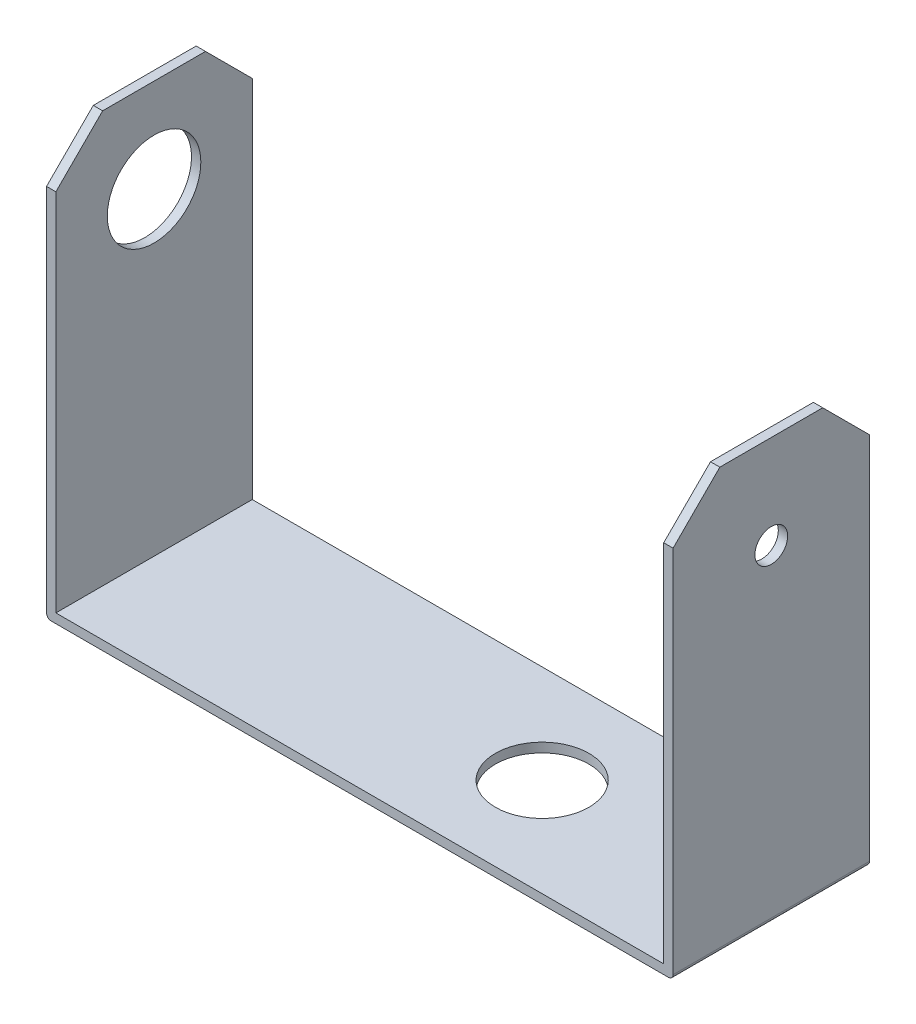
ISO-10303-21;
HEADER;
FILE_DESCRIPTION(('STEP AP214'),'2;1');
FILE_NAME('part.step','',(''),(''),'','','');
FILE_SCHEMA(('AUTOMOTIVE_DESIGN { 1 0 10303 214 1 1 1 1 }'));
ENDSEC;
DATA;
#1=APPLICATION_CONTEXT('core data for automotive mechanical design processes');
#2=APPLICATION_PROTOCOL_DEFINITION('international standard','automotive_design',2000,#1);
#3=PRODUCT_CONTEXT('',#1,'mechanical');
#4=PRODUCT('Part','Part','',(#3));
#5=PRODUCT_RELATED_PRODUCT_CATEGORY('part','',(#4));
#6=PRODUCT_DEFINITION_FORMATION('','',#4);
#7=PRODUCT_DEFINITION_CONTEXT('part definition',#1,'design');
#8=PRODUCT_DEFINITION('design','',#6,#7);
#9=PRODUCT_DEFINITION_SHAPE('','',#8);
#10=(LENGTH_UNIT() NAMED_UNIT(*) SI_UNIT(.MILLI.,.METRE.));
#11=(NAMED_UNIT(*) PLANE_ANGLE_UNIT() SI_UNIT($,.RADIAN.));
#12=(NAMED_UNIT(*) SI_UNIT($,.STERADIAN.) SOLID_ANGLE_UNIT());
#13=UNCERTAINTY_MEASURE_WITH_UNIT(LENGTH_MEASURE(1.E-05),#10,'distance_accuracy_value','');
#14=(GEOMETRIC_REPRESENTATION_CONTEXT(3) GLOBAL_UNCERTAINTY_ASSIGNED_CONTEXT((#13)) GLOBAL_UNIT_ASSIGNED_CONTEXT((#10,
#11,#12)) REPRESENTATION_CONTEXT('',''));
#15=CARTESIAN_POINT('',(0.,0.,0.));
#16=DIRECTION('',(0.,0.,1.));
#17=DIRECTION('',(1.,0.,0.));
#18=AXIS2_PLACEMENT_3D('',#15,#16,#17);
#19=CARTESIAN_POINT('',(0.,45.,-21.));
#20=DIRECTION('',(-1.,0.,0.));
#21=DIRECTION('',(0.,0.,1.));
#22=AXIS2_PLACEMENT_3D('',#19,#20,#21);
#23=PLANE('',#22);
#24=DIRECTION('',(0.,-1.,0.));
#25=VECTOR('',#24,1.);
#26=CARTESIAN_POINT('',(0.,45.,-21.));
#27=LINE('',#26,#25);
#28=CARTESIAN_POINT('',(0.,40.,-21.));
#29=VERTEX_POINT('',#28);
#30=CARTESIAN_POINT('',(0.,0.500000000000014,-21.));
#31=VERTEX_POINT('',#30);
#32=EDGE_CURVE('E193',#29,#31,#27,.T.);
#33=ORIENTED_EDGE('',*,*,#32,.F.);
#34=DIRECTION('',(0.,-0.707106781186547,-0.707106781186548));
#35=VECTOR('',#34,1.);
#36=CARTESIAN_POINT('',(0.,45.,-16.));
#37=LINE('',#36,#35);
#38=CARTESIAN_POINT('',(0.,45.,-16.));
#39=VERTEX_POINT('',#38);
#40=EDGE_CURVE('E11',#29,#39,#37,.F.);
#41=ORIENTED_EDGE('',*,*,#40,.T.);
#42=DIRECTION('',(0.,0.,-1.));
#43=VECTOR('',#42,1.);
#44=CARTESIAN_POINT('',(0.,45.,-21.));
#45=LINE('',#44,#43);
#46=CARTESIAN_POINT('',(0.,45.,-5.00000000000003));
#47=VERTEX_POINT('',#46);
#48=EDGE_CURVE('E177',#47,#39,#45,.T.);
#49=ORIENTED_EDGE('',*,*,#48,.F.);
#50=DIRECTION('',(0.,0.707106781186547,-0.707106781186548));
#51=VECTOR('',#50,1.);
#52=CARTESIAN_POINT('',(0.,45.,-5.00000000000003));
#53=LINE('',#52,#51);
#54=CARTESIAN_POINT('',(0.,40.,0.));
#55=VERTEX_POINT('',#54);
#56=EDGE_CURVE('E42',#47,#55,#53,.F.);
#57=ORIENTED_EDGE('',*,*,#56,.T.);
#58=DIRECTION('',(0.,-1.,0.));
#59=VECTOR('',#58,1.);
#60=CARTESIAN_POINT('',(0.,45.,0.));
#61=LINE('',#60,#59);
#62=CARTESIAN_POINT('',(0.,0.500000000000014,0.));
#63=VERTEX_POINT('',#62);
#64=EDGE_CURVE('E183',#55,#63,#61,.T.);
#65=ORIENTED_EDGE('',*,*,#64,.T.);
#66=DIRECTION('',(0.,0.,-1.));
#67=VECTOR('',#66,1.);
#68=CARTESIAN_POINT('',(0.,0.5,-21.));
#69=LINE('',#68,#67);
#70=EDGE_CURVE('E195',#63,#31,#69,.T.);
#71=ORIENTED_EDGE('',*,*,#70,.T.);
#72=EDGE_LOOP('',(#33,#41,#49,#57,#65,#71));
#73=FACE_BOUND('',#72,.T.);
#74=CARTESIAN_POINT('',(0.,35.,-10.5));
#75=DIRECTION('',(1.,0.,0.));
#76=DIRECTION('',(0.,0.,-1.));
#77=AXIS2_PLACEMENT_3D('',#74,#75,#76);
#78=CIRCLE('',#77,1.75);
#79=CARTESIAN_POINT('',(0.,35.,-12.25));
#80=VERTEX_POINT('',#79);
#81=EDGE_CURVE('E366',#80,#80,#78,.T.);
#82=ORIENTED_EDGE('',*,*,#81,.F.);
#83=EDGE_LOOP('',(#82));
#84=FACE_BOUND('',#83,.T.);
#85=ADVANCED_FACE('F34',(#73,#84),#23,.F.);
#86=CARTESIAN_POINT('',(0.,45.,0.));
#87=DIRECTION('',(0.,-1.,0.));
#88=DIRECTION('',(0.,0.,-1.));
#89=AXIS2_PLACEMENT_3D('',#86,#87,#88);
#90=PLANE('',#89);
#91=ORIENTED_EDGE('',*,*,#48,.T.);
#92=DIRECTION('',(-1.,0.,0.));
#93=VECTOR('',#92,1.);
#94=CARTESIAN_POINT('',(0.,45.,-16.));
#95=LINE('',#94,#93);
#96=CARTESIAN_POINT('',(-1.,45.,-16.));
#97=VERTEX_POINT('',#96);
#98=EDGE_CURVE('E239',#39,#97,#95,.T.);
#99=ORIENTED_EDGE('',*,*,#98,.T.);
#100=DIRECTION('',(0.,0.,-1.));
#101=VECTOR('',#100,1.);
#102=CARTESIAN_POINT('',(-1.,45.,0.));
#103=LINE('',#102,#101);
#104=CARTESIAN_POINT('',(-1.,45.,-5.00000000000003));
#105=VERTEX_POINT('',#104);
#106=EDGE_CURVE('E172',#105,#97,#103,.T.);
#107=ORIENTED_EDGE('',*,*,#106,.F.);
#108=DIRECTION('',(1.,0.,0.));
#109=VECTOR('',#108,1.);
#110=CARTESIAN_POINT('',(0.,45.,-5.00000000000003));
#111=LINE('',#110,#109);
#112=EDGE_CURVE('E237',#105,#47,#111,.T.);
#113=ORIENTED_EDGE('',*,*,#112,.T.);
#114=EDGE_LOOP('',(#91,#99,#107,#113));
#115=FACE_BOUND('',#114,.T.);
#116=ADVANCED_FACE('F254',(#115),#90,.F.);
#117=DIRECTION('',(0.,0.,1.));
#118=VECTOR('',#117,1.);
#119=CARTESIAN_POINT('',(-66.,45.,0.));
#120=LINE('',#119,#118);
#121=CARTESIAN_POINT('',(-66.,45.,-16.));
#122=VERTEX_POINT('',#121);
#123=CARTESIAN_POINT('',(-66.,45.,-5.00000000000003));
#124=VERTEX_POINT('',#123);
#125=EDGE_CURVE('E168',#122,#124,#120,.T.);
#126=ORIENTED_EDGE('',*,*,#125,.F.);
#127=DIRECTION('',(-1.,0.,0.));
#128=VECTOR('',#127,1.);
#129=CARTESIAN_POINT('',(0.,45.,-16.));
#130=LINE('',#129,#128);
#131=CARTESIAN_POINT('',(-67.,45.,-16.));
#132=VERTEX_POINT('',#131);
#133=EDGE_CURVE('E218',#122,#132,#130,.T.);
#134=ORIENTED_EDGE('',*,*,#133,.T.);
#135=DIRECTION('',(0.,0.,1.));
#136=VECTOR('',#135,1.);
#137=CARTESIAN_POINT('',(-67.,45.,0.));
#138=LINE('',#137,#136);
#139=CARTESIAN_POINT('',(-67.,45.,-5.00000000000003));
#140=VERTEX_POINT('',#139);
#141=EDGE_CURVE('E179',#132,#140,#138,.T.);
#142=ORIENTED_EDGE('',*,*,#141,.T.);
#143=DIRECTION('',(1.,0.,0.));
#144=VECTOR('',#143,1.);
#145=CARTESIAN_POINT('',(0.,45.,-5.00000000000003));
#146=LINE('',#145,#144);
#147=EDGE_CURVE('E215',#140,#124,#146,.T.);
#148=ORIENTED_EDGE('',*,*,#147,.T.);
#149=EDGE_LOOP('',(#126,#134,#142,#148));
#150=FACE_BOUND('',#149,.T.);
#151=ADVANCED_FACE('F282',(#150),#90,.F.);
#152=CARTESIAN_POINT('',(-67.,45.,-21.));
#153=DIRECTION('',(0.,0.,1.));
#154=DIRECTION('',(1.,0.,0.));
#155=AXIS2_PLACEMENT_3D('',#152,#153,#154);
#156=PLANE('',#155);
#157=DIRECTION('',(0.,-1.,0.));
#158=VECTOR('',#157,1.);
#159=CARTESIAN_POINT('',(-67.,45.,-21.));
#160=LINE('',#159,#158);
#161=CARTESIAN_POINT('',(-67.,40.,-21.));
#162=VERTEX_POINT('',#161);
#163=CARTESIAN_POINT('',(-67.,0.500000000000014,-21.));
#164=VERTEX_POINT('',#163);
#165=EDGE_CURVE('E191',#162,#164,#160,.T.);
#166=ORIENTED_EDGE('',*,*,#165,.F.);
#167=DIRECTION('',(1.,0.,0.));
#168=VECTOR('',#167,1.);
#169=CARTESIAN_POINT('',(-67.,40.,-21.));
#170=LINE('',#169,#168);
#171=CARTESIAN_POINT('',(-66.,40.,-21.));
#172=VERTEX_POINT('',#171);
#173=EDGE_CURVE('E227',#162,#172,#170,.T.);
#174=ORIENTED_EDGE('',*,*,#173,.T.);
#175=DIRECTION('',(0.,-1.,0.));
#176=VECTOR('',#175,1.);
#177=CARTESIAN_POINT('',(-66.,45.,-21.));
#178=LINE('',#177,#176);
#179=CARTESIAN_POINT('',(-66.,1.,-21.));
#180=VERTEX_POINT('',#179);
#181=EDGE_CURVE('E146',#172,#180,#178,.T.);
#182=ORIENTED_EDGE('',*,*,#181,.T.);
#183=DIRECTION('',(-1.,0.,0.));
#184=VECTOR('',#183,1.);
#185=CARTESIAN_POINT('',(0.,1.,-21.));
#186=LINE('',#185,#184);
#187=CARTESIAN_POINT('',(-1.,1.,-21.));
#188=VERTEX_POINT('',#187);
#189=EDGE_CURVE('E153',#188,#180,#186,.T.);
#190=ORIENTED_EDGE('',*,*,#189,.F.);
#191=DIRECTION('',(0.,-1.,0.));
#192=VECTOR('',#191,1.);
#193=CARTESIAN_POINT('',(-1.00000000000001,45.,-21.));
#194=LINE('',#193,#192);
#195=CARTESIAN_POINT('',(-1.00000000000001,40.,-21.));
#196=VERTEX_POINT('',#195);
#197=EDGE_CURVE('E135',#196,#188,#194,.T.);
#198=ORIENTED_EDGE('',*,*,#197,.F.);
#199=DIRECTION('',(1.,0.,0.));
#200=VECTOR('',#199,1.);
#201=CARTESIAN_POINT('',(-67.,40.,-21.));
#202=LINE('',#201,#200);
#203=EDGE_CURVE('E225',#196,#29,#202,.T.);
#204=ORIENTED_EDGE('',*,*,#203,.T.);
#205=ORIENTED_EDGE('',*,*,#32,.T.);
#206=CARTESIAN_POINT('',(-0.5,0.5,-21.));
#207=DIRECTION('',(0.,0.,1.));
#208=DIRECTION('',(1.,0.,0.));
#209=AXIS2_PLACEMENT_3D('',#206,#207,#208);
#210=CIRCLE('',#209,0.5);
#211=CARTESIAN_POINT('',(-0.5,0.,-21.));
#212=VERTEX_POINT('',#211);
#213=EDGE_CURVE('E201',#31,#212,#210,.F.);
#214=ORIENTED_EDGE('',*,*,#213,.T.);
#215=DIRECTION('',(-1.,0.,0.));
#216=VECTOR('',#215,1.);
#217=CARTESIAN_POINT('',(-67.,0.,-21.));
#218=LINE('',#217,#216);
#219=CARTESIAN_POINT('',(-66.5,0.,-21.));
#220=VERTEX_POINT('',#219);
#221=EDGE_CURVE('E145',#212,#220,#218,.T.);
#222=ORIENTED_EDGE('',*,*,#221,.T.);
#223=CARTESIAN_POINT('',(-66.5,0.5,-21.));
#224=DIRECTION('',(0.,0.,1.));
#225=DIRECTION('',(1.,0.,0.));
#226=AXIS2_PLACEMENT_3D('',#223,#224,#225);
#227=CIRCLE('',#226,0.5);
#228=EDGE_CURVE('E198',#220,#164,#227,.F.);
#229=ORIENTED_EDGE('',*,*,#228,.T.);
#230=EDGE_LOOP('',(#166,#174,#182,#190,#198,#204,#205,#214,#222,#229));
#231=FACE_BOUND('',#230,.T.);
#232=ADVANCED_FACE('F160',(#231),#156,.F.);
#233=CARTESIAN_POINT('',(-67.,45.,0.));
#234=DIRECTION('',(1.,0.,0.));
#235=DIRECTION('',(0.,0.,-1.));
#236=AXIS2_PLACEMENT_3D('',#233,#234,#235);
#237=PLANE('',#236);
#238=CARTESIAN_POINT('',(-67.,35.,-10.5));
#239=DIRECTION('',(-1.,0.,0.));
#240=DIRECTION('',(0.,0.,1.));
#241=AXIS2_PLACEMENT_3D('',#238,#239,#240);
#242=CIRCLE('',#241,4.99999999999999);
#243=CARTESIAN_POINT('',(-67.,35.,-5.50000000000001));
#244=VERTEX_POINT('',#243);
#245=EDGE_CURVE('E353',#244,#244,#242,.T.);
#246=ORIENTED_EDGE('',*,*,#245,.F.);
#247=EDGE_LOOP('',(#246));
#248=FACE_BOUND('',#247,.T.);
#249=ORIENTED_EDGE('',*,*,#141,.F.);
#250=DIRECTION('',(0.,0.707106781186547,0.707106781186548));
#251=VECTOR('',#250,1.);
#252=CARTESIAN_POINT('',(-67.,45.,-16.));
#253=LINE('',#252,#251);
#254=EDGE_CURVE('E223',#132,#162,#253,.F.);
#255=ORIENTED_EDGE('',*,*,#254,.T.);
#256=ORIENTED_EDGE('',*,*,#165,.T.);
#257=DIRECTION('',(0.,0.,1.));
#258=VECTOR('',#257,1.);
#259=CARTESIAN_POINT('',(-67.,0.5,0.));
#260=LINE('',#259,#258);
#261=CARTESIAN_POINT('',(-67.,0.500000000000014,0.));
#262=VERTEX_POINT('',#261);
#263=EDGE_CURVE('E212',#164,#262,#260,.T.);
#264=ORIENTED_EDGE('',*,*,#263,.T.);
#265=DIRECTION('',(0.,-1.,0.));
#266=VECTOR('',#265,1.);
#267=CARTESIAN_POINT('',(-67.,45.,0.));
#268=LINE('',#267,#266);
#269=CARTESIAN_POINT('',(-67.,40.,0.));
#270=VERTEX_POINT('',#269);
#271=EDGE_CURVE('E189',#270,#262,#268,.T.);
#272=ORIENTED_EDGE('',*,*,#271,.F.);
#273=DIRECTION('',(0.,-0.707106781186547,0.707106781186548));
#274=VECTOR('',#273,1.);
#275=CARTESIAN_POINT('',(-67.,45.,-5.00000000000003));
#276=LINE('',#275,#274);
#277=EDGE_CURVE('E221',#270,#140,#276,.F.);
#278=ORIENTED_EDGE('',*,*,#277,.T.);
#279=EDGE_LOOP('',(#249,#255,#256,#264,#272,#278));
#280=FACE_BOUND('',#279,.T.);
#281=ADVANCED_FACE('F290',(#248,#280),#237,.F.);
#282=CARTESIAN_POINT('',(0.,45.,0.));
#283=DIRECTION('',(0.,0.,-1.));
#284=DIRECTION('',(-1.,0.,0.));
#285=AXIS2_PLACEMENT_3D('',#282,#283,#284);
#286=PLANE('',#285);
#287=DIRECTION('',(0.,-1.,0.));
#288=VECTOR('',#287,1.);
#289=CARTESIAN_POINT('',(-66.,45.,0.));
#290=LINE('',#289,#288);
#291=CARTESIAN_POINT('',(-66.,40.,0.));
#292=VERTEX_POINT('',#291);
#293=CARTESIAN_POINT('',(-66.,1.,0.));
#294=VERTEX_POINT('',#293);
#295=EDGE_CURVE('E167',#292,#294,#290,.T.);
#296=ORIENTED_EDGE('',*,*,#295,.F.);
#297=DIRECTION('',(-1.,0.,0.));
#298=VECTOR('',#297,1.);
#299=CARTESIAN_POINT('',(0.,40.,0.));
#300=LINE('',#299,#298);
#301=EDGE_CURVE('E235',#292,#270,#300,.T.);
#302=ORIENTED_EDGE('',*,*,#301,.T.);
#303=ORIENTED_EDGE('',*,*,#271,.T.);
#304=CARTESIAN_POINT('',(-66.5,0.5,0.));
#305=DIRECTION('',(0.,0.,-1.));
#306=DIRECTION('',(-1.,0.,0.));
#307=AXIS2_PLACEMENT_3D('',#304,#305,#306);
#308=CIRCLE('',#307,0.5);
#309=CARTESIAN_POINT('',(-66.5,0.,0.));
#310=VERTEX_POINT('',#309);
#311=EDGE_CURVE('E207',#262,#310,#308,.F.);
#312=ORIENTED_EDGE('',*,*,#311,.T.);
#313=DIRECTION('',(1.,0.,0.));
#314=VECTOR('',#313,1.);
#315=CARTESIAN_POINT('',(0.,0.,0.));
#316=LINE('',#315,#314);
#317=CARTESIAN_POINT('',(-0.5,0.,0.));
#318=VERTEX_POINT('',#317);
#319=EDGE_CURVE('E180',#310,#318,#316,.T.);
#320=ORIENTED_EDGE('',*,*,#319,.T.);
#321=CARTESIAN_POINT('',(-0.5,0.5,0.));
#322=DIRECTION('',(0.,0.,-1.));
#323=DIRECTION('',(-1.,0.,0.));
#324=AXIS2_PLACEMENT_3D('',#321,#322,#323);
#325=CIRCLE('',#324,0.5);
#326=EDGE_CURVE('E209',#318,#63,#325,.F.);
#327=ORIENTED_EDGE('',*,*,#326,.T.);
#328=ORIENTED_EDGE('',*,*,#64,.F.);
#329=DIRECTION('',(-1.,0.,0.));
#330=VECTOR('',#329,1.);
#331=CARTESIAN_POINT('',(0.,40.,0.));
#332=LINE('',#331,#330);
#333=CARTESIAN_POINT('',(-1.,40.,0.));
#334=VERTEX_POINT('',#333);
#335=EDGE_CURVE('E233',#55,#334,#332,.T.);
#336=ORIENTED_EDGE('',*,*,#335,.T.);
#337=DIRECTION('',(0.,-1.,0.));
#338=VECTOR('',#337,1.);
#339=CARTESIAN_POINT('',(-1.,45.,0.));
#340=LINE('',#339,#338);
#341=CARTESIAN_POINT('',(-1.,1.,0.));
#342=VERTEX_POINT('',#341);
#343=EDGE_CURVE('E171',#334,#342,#340,.T.);
#344=ORIENTED_EDGE('',*,*,#343,.T.);
#345=DIRECTION('',(1.,0.,0.));
#346=VECTOR('',#345,1.);
#347=CARTESIAN_POINT('',(0.,1.,0.));
#348=LINE('',#347,#346);
#349=EDGE_CURVE('E156',#294,#342,#348,.T.);
#350=ORIENTED_EDGE('',*,*,#349,.F.);
#351=EDGE_LOOP('',(#296,#302,#303,#312,#320,#327,#328,#336,#344,#350));
#352=FACE_BOUND('',#351,.T.);
#353=ADVANCED_FACE('F248',(#352),#286,.F.);
#354=CARTESIAN_POINT('',(0.,0.,0.));
#355=DIRECTION('',(0.,-1.,0.));
#356=DIRECTION('',(0.,0.,-1.));
#357=AXIS2_PLACEMENT_3D('',#354,#355,#356);
#358=PLANE('',#357);
#359=CARTESIAN_POINT('',(-24.5,0.,-10.5));
#360=DIRECTION('',(0.,-1.,0.));
#361=DIRECTION('',(0.,0.,-1.));
#362=AXIS2_PLACEMENT_3D('',#359,#360,#361);
#363=CIRCLE('',#362,4.99999999999999);
#364=CARTESIAN_POINT('',(-24.5,0.,-15.5));
#365=VERTEX_POINT('',#364);
#366=EDGE_CURVE('E351',#365,#365,#363,.T.);
#367=ORIENTED_EDGE('',*,*,#366,.F.);
#368=EDGE_LOOP('',(#367));
#369=FACE_BOUND('',#368,.T.);
#370=ORIENTED_EDGE('',*,*,#221,.F.);
#371=DIRECTION('',(0.,0.,-1.));
#372=VECTOR('',#371,1.);
#373=CARTESIAN_POINT('',(-0.5,0.,0.));
#374=LINE('',#373,#372);
#375=EDGE_CURVE('E205',#212,#318,#374,.F.);
#376=ORIENTED_EDGE('',*,*,#375,.T.);
#377=ORIENTED_EDGE('',*,*,#319,.F.);
#378=DIRECTION('',(0.,0.,1.));
#379=VECTOR('',#378,1.);
#380=CARTESIAN_POINT('',(-66.5,0.,-21.));
#381=LINE('',#380,#379);
#382=EDGE_CURVE('E203',#310,#220,#381,.F.);
#383=ORIENTED_EDGE('',*,*,#382,.T.);
#384=EDGE_LOOP('',(#370,#376,#377,#383));
#385=FACE_BOUND('',#384,.T.);
#386=ADVANCED_FACE('F265',(#369,#385),#358,.T.);
#387=CARTESIAN_POINT('',(-1.,45.,-21.));
#388=DIRECTION('',(-1.,0.,0.));
#389=DIRECTION('',(0.,0.,1.));
#390=AXIS2_PLACEMENT_3D('',#387,#388,#389);
#391=PLANE('',#390);
#392=CARTESIAN_POINT('',(-1.,35.,-10.5));
#393=DIRECTION('',(-1.,0.,0.));
#394=DIRECTION('',(0.,0.,1.));
#395=AXIS2_PLACEMENT_3D('',#392,#393,#394);
#396=CIRCLE('',#395,1.75);
#397=CARTESIAN_POINT('',(-1.,35.,-8.75));
#398=VERTEX_POINT('',#397);
#399=EDGE_CURVE('E358',#398,#398,#396,.T.);
#400=ORIENTED_EDGE('',*,*,#399,.F.);
#401=EDGE_LOOP('',(#400));
#402=FACE_BOUND('',#401,.T.);
#403=ORIENTED_EDGE('',*,*,#106,.T.);
#404=DIRECTION('',(0.,0.707106781186547,0.707106781186548));
#405=VECTOR('',#404,1.);
#406=CARTESIAN_POINT('',(-1.,42.5,-18.5));
#407=LINE('',#406,#405);
#408=EDGE_CURVE('E141',#97,#196,#407,.F.);
#409=ORIENTED_EDGE('',*,*,#408,.T.);
#410=ORIENTED_EDGE('',*,*,#197,.T.);
#411=DIRECTION('',(0.,0.,-1.));
#412=VECTOR('',#411,1.);
#413=CARTESIAN_POINT('',(-1.,1.,0.));
#414=LINE('',#413,#412);
#415=EDGE_CURVE('E140',#342,#188,#414,.T.);
#416=ORIENTED_EDGE('',*,*,#415,.F.);
#417=ORIENTED_EDGE('',*,*,#343,.F.);
#418=DIRECTION('',(0.,-0.707106781186547,0.707106781186548));
#419=VECTOR('',#418,1.);
#420=CARTESIAN_POINT('',(-1.,53.,-13.));
#421=LINE('',#420,#419);
#422=EDGE_CURVE('E242',#334,#105,#421,.F.);
#423=ORIENTED_EDGE('',*,*,#422,.T.);
#424=EDGE_LOOP('',(#403,#409,#410,#416,#417,#423));
#425=FACE_BOUND('',#424,.T.);
#426=ADVANCED_FACE('F138',(#402,#425),#391,.T.);
#427=CARTESIAN_POINT('',(-66.,45.,0.));
#428=DIRECTION('',(1.,0.,0.));
#429=DIRECTION('',(0.,0.,-1.));
#430=AXIS2_PLACEMENT_3D('',#427,#428,#429);
#431=PLANE('',#430);
#432=CARTESIAN_POINT('',(-66.,35.,-10.5));
#433=DIRECTION('',(1.,0.,0.));
#434=DIRECTION('',(0.,0.,-1.));
#435=AXIS2_PLACEMENT_3D('',#432,#433,#434);
#436=CIRCLE('',#435,4.99999999999999);
#437=CARTESIAN_POINT('',(-66.,35.,-15.5));
#438=VERTEX_POINT('',#437);
#439=EDGE_CURVE('E157',#438,#438,#436,.T.);
#440=ORIENTED_EDGE('',*,*,#439,.F.);
#441=EDGE_LOOP('',(#440));
#442=FACE_BOUND('',#441,.T.);
#443=ORIENTED_EDGE('',*,*,#181,.F.);
#444=DIRECTION('',(0.,-0.707106781186547,-0.707106781186548));
#445=VECTOR('',#444,1.);
#446=CARTESIAN_POINT('',(-66.,53.,-7.99999999999997));
#447=LINE('',#446,#445);
#448=EDGE_CURVE('E231',#172,#122,#447,.F.);
#449=ORIENTED_EDGE('',*,*,#448,.T.);
#450=ORIENTED_EDGE('',*,*,#125,.T.);
#451=DIRECTION('',(0.,0.707106781186547,-0.707106781186548));
#452=VECTOR('',#451,1.);
#453=CARTESIAN_POINT('',(-66.,42.5,-2.50000000000001));
#454=LINE('',#453,#452);
#455=EDGE_CURVE('E229',#124,#292,#454,.F.);
#456=ORIENTED_EDGE('',*,*,#455,.T.);
#457=ORIENTED_EDGE('',*,*,#295,.T.);
#458=DIRECTION('',(0.,0.,1.));
#459=VECTOR('',#458,1.);
#460=CARTESIAN_POINT('',(-66.,1.,0.));
#461=LINE('',#460,#459);
#462=EDGE_CURVE('E162',#180,#294,#461,.T.);
#463=ORIENTED_EDGE('',*,*,#462,.F.);
#464=EDGE_LOOP('',(#443,#449,#450,#456,#457,#463));
#465=FACE_BOUND('',#464,.T.);
#466=ADVANCED_FACE('F280',(#442,#465),#431,.T.);
#467=CARTESIAN_POINT('',(0.,1.,0.));
#468=DIRECTION('',(0.,-1.,0.));
#469=DIRECTION('',(0.,0.,-1.));
#470=AXIS2_PLACEMENT_3D('',#467,#468,#469);
#471=PLANE('',#470);
#472=CARTESIAN_POINT('',(-24.5,1.,-10.5));
#473=DIRECTION('',(0.,1.,0.));
#474=DIRECTION('',(0.,0.,1.));
#475=AXIS2_PLACEMENT_3D('',#472,#473,#474);
#476=CIRCLE('',#475,4.99999999999999);
#477=CARTESIAN_POINT('',(-24.5,1.,-5.50000000000001));
#478=VERTEX_POINT('',#477);
#479=EDGE_CURVE('E354',#478,#478,#476,.T.);
#480=ORIENTED_EDGE('',*,*,#479,.F.);
#481=EDGE_LOOP('',(#480));
#482=FACE_BOUND('',#481,.T.);
#483=ORIENTED_EDGE('',*,*,#415,.T.);
#484=ORIENTED_EDGE('',*,*,#189,.T.);
#485=ORIENTED_EDGE('',*,*,#462,.T.);
#486=ORIENTED_EDGE('',*,*,#349,.T.);
#487=EDGE_LOOP('',(#483,#484,#485,#486));
#488=FACE_BOUND('',#487,.T.);
#489=ADVANCED_FACE('F151',(#482,#488),#471,.F.);
#490=CARTESIAN_POINT('',(-0.5,0.5,-21.));
#491=DIRECTION('',(0.,0.,1.));
#492=DIRECTION('',(1.,0.,0.));
#493=AXIS2_PLACEMENT_3D('',#490,#491,#492);
#494=CYLINDRICAL_SURFACE('',#493,0.5);
#495=ORIENTED_EDGE('',*,*,#326,.F.);
#496=ORIENTED_EDGE('',*,*,#375,.F.);
#497=ORIENTED_EDGE('',*,*,#213,.F.);
#498=ORIENTED_EDGE('',*,*,#70,.F.);
#499=EDGE_LOOP('',(#495,#496,#497,#498));
#500=FACE_BOUND('',#499,.T.);
#501=ADVANCED_FACE('F260',(#500),#494,.T.);
#502=CARTESIAN_POINT('',(-66.5,0.5,0.));
#503=DIRECTION('',(0.,0.,-1.));
#504=DIRECTION('',(-1.,0.,0.));
#505=AXIS2_PLACEMENT_3D('',#502,#503,#504);
#506=CYLINDRICAL_SURFACE('',#505,0.5);
#507=ORIENTED_EDGE('',*,*,#228,.F.);
#508=ORIENTED_EDGE('',*,*,#382,.F.);
#509=ORIENTED_EDGE('',*,*,#311,.F.);
#510=ORIENTED_EDGE('',*,*,#263,.F.);
#511=EDGE_LOOP('',(#507,#508,#509,#510));
#512=FACE_BOUND('',#511,.T.);
#513=ADVANCED_FACE('F270',(#512),#506,.T.);
#514=CARTESIAN_POINT('',(0.,45.,-16.));
#515=DIRECTION('',(0.,-0.707106781186548,0.707106781186547));
#516=DIRECTION('',(-1.,0.,0.));
#517=AXIS2_PLACEMENT_3D('',#514,#515,#516);
#518=PLANE('',#517);
#519=ORIENTED_EDGE('',*,*,#448,.F.);
#520=ORIENTED_EDGE('',*,*,#173,.F.);
#521=ORIENTED_EDGE('',*,*,#254,.F.);
#522=ORIENTED_EDGE('',*,*,#133,.F.);
#523=EDGE_LOOP('',(#519,#520,#521,#522));
#524=FACE_BOUND('',#523,.T.);
#525=ADVANCED_FACE('F276',(#524),#518,.F.);
#526=CARTESIAN_POINT('',(0.,45.,-5.00000000000003));
#527=DIRECTION('',(0.,-0.707106781186548,-0.707106781186547));
#528=DIRECTION('',(1.,0.,0.));
#529=AXIS2_PLACEMENT_3D('',#526,#527,#528);
#530=PLANE('',#529);
#531=ORIENTED_EDGE('',*,*,#277,.F.);
#532=ORIENTED_EDGE('',*,*,#301,.F.);
#533=ORIENTED_EDGE('',*,*,#455,.F.);
#534=ORIENTED_EDGE('',*,*,#147,.F.);
#535=EDGE_LOOP('',(#531,#532,#533,#534));
#536=FACE_BOUND('',#535,.T.);
#537=ADVANCED_FACE('F287',(#536),#530,.F.);
#538=CARTESIAN_POINT('',(0.,45.,-16.));
#539=DIRECTION('',(0.,-0.707106781186548,0.707106781186547));
#540=DIRECTION('',(-1.,0.,0.));
#541=AXIS2_PLACEMENT_3D('',#538,#539,#540);
#542=PLANE('',#541);
#543=ORIENTED_EDGE('',*,*,#40,.F.);
#544=ORIENTED_EDGE('',*,*,#203,.F.);
#545=ORIENTED_EDGE('',*,*,#408,.F.);
#546=ORIENTED_EDGE('',*,*,#98,.F.);
#547=EDGE_LOOP('',(#543,#544,#545,#546));
#548=FACE_BOUND('',#547,.T.);
#549=ADVANCED_FACE('F257',(#548),#542,.F.);
#550=CARTESIAN_POINT('',(0.,45.,-5.00000000000003));
#551=DIRECTION('',(0.,-0.707106781186548,-0.707106781186547));
#552=DIRECTION('',(1.,0.,0.));
#553=AXIS2_PLACEMENT_3D('',#550,#551,#552);
#554=PLANE('',#553);
#555=ORIENTED_EDGE('',*,*,#422,.F.);
#556=ORIENTED_EDGE('',*,*,#335,.F.);
#557=ORIENTED_EDGE('',*,*,#56,.F.);
#558=ORIENTED_EDGE('',*,*,#112,.F.);
#559=EDGE_LOOP('',(#555,#556,#557,#558));
#560=FACE_BOUND('',#559,.T.);
#561=ADVANCED_FACE('F36',(#560),#554,.F.);
#562=CARTESIAN_POINT('',(-67.,35.,-10.5));
#563=DIRECTION('',(-1.,0.,0.));
#564=DIRECTION('',(0.,0.,1.));
#565=AXIS2_PLACEMENT_3D('',#562,#563,#564);
#566=CYLINDRICAL_SURFACE('',#565,4.99999999999999);
#567=ORIENTED_EDGE('',*,*,#245,.T.);
#568=EDGE_LOOP('',(#567));
#569=FACE_BOUND('',#568,.T.);
#570=ORIENTED_EDGE('',*,*,#439,.T.);
#571=EDGE_LOOP('',(#570));
#572=FACE_BOUND('',#571,.T.);
#573=ADVANCED_FACE('F319',(#569,#572),#566,.F.);
#574=CARTESIAN_POINT('',(-24.5,1.,-10.5));
#575=DIRECTION('',(0.,1.,0.));
#576=DIRECTION('',(0.,0.,1.));
#577=AXIS2_PLACEMENT_3D('',#574,#575,#576);
#578=CYLINDRICAL_SURFACE('',#577,4.99999999999999);
#579=ORIENTED_EDGE('',*,*,#479,.T.);
#580=EDGE_LOOP('',(#579));
#581=FACE_BOUND('',#580,.T.);
#582=ORIENTED_EDGE('',*,*,#366,.T.);
#583=EDGE_LOOP('',(#582));
#584=FACE_BOUND('',#583,.T.);
#585=ADVANCED_FACE('F323',(#581,#584),#578,.F.);
#586=CARTESIAN_POINT('',(0.,35.,-10.5));
#587=DIRECTION('',(1.,0.,0.));
#588=DIRECTION('',(0.,0.,-1.));
#589=AXIS2_PLACEMENT_3D('',#586,#587,#588);
#590=CYLINDRICAL_SURFACE('',#589,1.75);
#591=ORIENTED_EDGE('',*,*,#81,.T.);
#592=EDGE_LOOP('',(#591));
#593=FACE_BOUND('',#592,.T.);
#594=ORIENTED_EDGE('',*,*,#399,.T.);
#595=EDGE_LOOP('',(#594));
#596=FACE_BOUND('',#595,.T.);
#597=ADVANCED_FACE('F329',(#593,#596),#590,.F.);
#598=CLOSED_SHELL('',(#85,#116,#151,#232,#281,#353,#386,#426,#466,#489,#501,#513,#525,#537,#549,
#561,#573,#585,#597));
#599=MANIFOLD_SOLID_BREP('B2',#598);
#600=ADVANCED_BREP_SHAPE_REPRESENTATION('',(#18,#599),#14);
#601=SHAPE_DEFINITION_REPRESENTATION(#9,#600);
ENDSEC;
END-ISO-10303-21;
